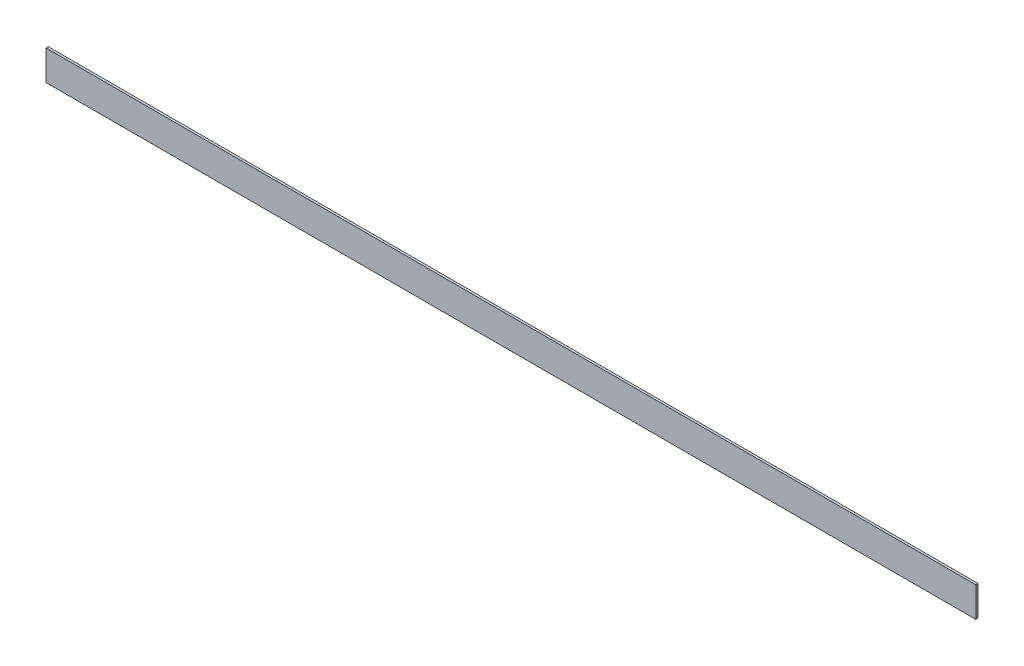
ISO-10303-21;
HEADER;
FILE_DESCRIPTION(('STEP AP214'),'2;1');
FILE_NAME('part.step','',(''),(''),'','','');
FILE_SCHEMA(('AUTOMOTIVE_DESIGN { 1 0 10303 214 1 1 1 1 }'));
ENDSEC;
DATA;
#1=APPLICATION_CONTEXT('core data for automotive mechanical design processes');
#2=APPLICATION_PROTOCOL_DEFINITION('international standard','automotive_design',2000,#1);
#3=PRODUCT_CONTEXT('',#1,'mechanical');
#4=PRODUCT('Part','Part','',(#3));
#5=PRODUCT_RELATED_PRODUCT_CATEGORY('part','',(#4));
#6=PRODUCT_DEFINITION_FORMATION('','',#4);
#7=PRODUCT_DEFINITION_CONTEXT('part definition',#1,'design');
#8=PRODUCT_DEFINITION('design','',#6,#7);
#9=PRODUCT_DEFINITION_SHAPE('','',#8);
#10=(LENGTH_UNIT() NAMED_UNIT(*) SI_UNIT(.MILLI.,.METRE.));
#11=(NAMED_UNIT(*) PLANE_ANGLE_UNIT() SI_UNIT($,.RADIAN.));
#12=(NAMED_UNIT(*) SI_UNIT($,.STERADIAN.) SOLID_ANGLE_UNIT());
#13=UNCERTAINTY_MEASURE_WITH_UNIT(LENGTH_MEASURE(1.E-05),#10,'distance_accuracy_value','');
#14=(GEOMETRIC_REPRESENTATION_CONTEXT(3) GLOBAL_UNCERTAINTY_ASSIGNED_CONTEXT((#13)) GLOBAL_UNIT_ASSIGNED_CONTEXT((#10,
#11,#12)) REPRESENTATION_CONTEXT('',''));
#15=CARTESIAN_POINT('',(0.,0.,0.));
#16=DIRECTION('',(0.,0.,1.));
#17=DIRECTION('',(1.,0.,0.));
#18=AXIS2_PLACEMENT_3D('',#15,#16,#17);
#19=CARTESIAN_POINT('',(40.,1132.,-21.5));
#20=DIRECTION('',(-1.,0.,0.));
#21=DIRECTION('',(0.,0.,1.));
#22=AXIS2_PLACEMENT_3D('',#19,#20,#21);
#23=PLANE('',#22);
#24=DIRECTION('',(0.,-1.,0.));
#25=VECTOR('',#24,1.);
#26=CARTESIAN_POINT('',(40.,1132.,-20.));
#27=LINE('',#26,#25);
#28=CARTESIAN_POINT('',(40.,1152.,-20.));
#29=VERTEX_POINT('',#28);
#30=CARTESIAN_POINT('',(40.,1132.,-20.));
#31=VERTEX_POINT('',#30);
#32=EDGE_CURVE('E103',#29,#31,#27,.T.);
#33=ORIENTED_EDGE('',*,*,#32,.F.);
#34=DIRECTION('',(0.,0.,1.));
#35=VECTOR('',#34,1.);
#36=CARTESIAN_POINT('',(40.,1152.,-21.5));
#37=LINE('',#36,#35);
#38=CARTESIAN_POINT('',(40.,1152.,-21.5));
#39=VERTEX_POINT('',#38);
#40=EDGE_CURVE('E11',#39,#29,#37,.T.);
#41=ORIENTED_EDGE('',*,*,#40,.F.);
#42=DIRECTION('',(0.,-1.,0.));
#43=VECTOR('',#42,1.);
#44=CARTESIAN_POINT('',(40.,1132.,-21.5));
#45=LINE('',#44,#43);
#46=CARTESIAN_POINT('',(40.,1132.,-21.5));
#47=VERTEX_POINT('',#46);
#48=EDGE_CURVE('E97',#39,#47,#45,.T.);
#49=ORIENTED_EDGE('',*,*,#48,.T.);
#50=DIRECTION('',(0.,0.,1.));
#51=VECTOR('',#50,1.);
#52=CARTESIAN_POINT('',(40.,1132.,-21.5));
#53=LINE('',#52,#51);
#54=EDGE_CURVE('E42',#47,#31,#53,.T.);
#55=ORIENTED_EDGE('',*,*,#54,.T.);
#56=EDGE_LOOP('',(#33,#41,#49,#55));
#57=FACE_BOUND('',#56,.T.);
#58=ADVANCED_FACE('F39',(#57),#23,.T.);
#59=CARTESIAN_POINT('',(40.,1152.,-21.5));
#60=DIRECTION('',(0.,1.,0.));
#61=DIRECTION('',(0.,0.,1.));
#62=AXIS2_PLACEMENT_3D('',#59,#60,#61);
#63=PLANE('',#62);
#64=DIRECTION('',(-1.,0.,0.));
#65=VECTOR('',#64,1.);
#66=CARTESIAN_POINT('',(40.,1152.,-20.));
#67=LINE('',#66,#65);
#68=CARTESIAN_POINT('',(660.,1152.,-20.));
#69=VERTEX_POINT('',#68);
#70=EDGE_CURVE('E99',#69,#29,#67,.T.);
#71=ORIENTED_EDGE('',*,*,#70,.F.);
#72=DIRECTION('',(0.,0.,1.));
#73=VECTOR('',#72,1.);
#74=CARTESIAN_POINT('',(660.,1152.,-21.5));
#75=LINE('',#74,#73);
#76=CARTESIAN_POINT('',(660.,1152.,-21.5));
#77=VERTEX_POINT('',#76);
#78=EDGE_CURVE('E48',#77,#69,#75,.T.);
#79=ORIENTED_EDGE('',*,*,#78,.F.);
#80=DIRECTION('',(-1.,0.,0.));
#81=VECTOR('',#80,1.);
#82=CARTESIAN_POINT('',(40.,1152.,-21.5));
#83=LINE('',#82,#81);
#84=EDGE_CURVE('E94',#77,#39,#83,.T.);
#85=ORIENTED_EDGE('',*,*,#84,.T.);
#86=ORIENTED_EDGE('',*,*,#40,.T.);
#87=EDGE_LOOP('',(#71,#79,#85,#86));
#88=FACE_BOUND('',#87,.T.);
#89=ADVANCED_FACE('F113',(#88),#63,.T.);
#90=CARTESIAN_POINT('',(660.,1132.,-21.5));
#91=DIRECTION('',(1.,0.,0.));
#92=DIRECTION('',(0.,0.,-1.));
#93=AXIS2_PLACEMENT_3D('',#90,#91,#92);
#94=PLANE('',#93);
#95=DIRECTION('',(0.,1.,0.));
#96=VECTOR('',#95,1.);
#97=CARTESIAN_POINT('',(660.,1132.,-20.));
#98=LINE('',#97,#96);
#99=CARTESIAN_POINT('',(660.,1132.,-20.));
#100=VERTEX_POINT('',#99);
#101=EDGE_CURVE('E89',#100,#69,#98,.T.);
#102=ORIENTED_EDGE('',*,*,#101,.F.);
#103=DIRECTION('',(0.,0.,1.));
#104=VECTOR('',#103,1.);
#105=CARTESIAN_POINT('',(660.,1132.,-21.5));
#106=LINE('',#105,#104);
#107=CARTESIAN_POINT('',(660.,1132.,-21.5));
#108=VERTEX_POINT('',#107);
#109=EDGE_CURVE('E84',#108,#100,#106,.T.);
#110=ORIENTED_EDGE('',*,*,#109,.F.);
#111=DIRECTION('',(0.,1.,0.));
#112=VECTOR('',#111,1.);
#113=CARTESIAN_POINT('',(660.,1132.,-21.5));
#114=LINE('',#113,#112);
#115=EDGE_CURVE('E87',#108,#77,#114,.T.);
#116=ORIENTED_EDGE('',*,*,#115,.T.);
#117=ORIENTED_EDGE('',*,*,#78,.T.);
#118=EDGE_LOOP('',(#102,#110,#116,#117));
#119=FACE_BOUND('',#118,.T.);
#120=ADVANCED_FACE('F86',(#119),#94,.T.);
#121=CARTESIAN_POINT('',(40.,1132.,-21.5));
#122=DIRECTION('',(0.,-1.,0.));
#123=DIRECTION('',(0.,0.,-1.));
#124=AXIS2_PLACEMENT_3D('',#121,#122,#123);
#125=PLANE('',#124);
#126=DIRECTION('',(1.,0.,0.));
#127=VECTOR('',#126,1.);
#128=CARTESIAN_POINT('',(40.,1132.,-20.));
#129=LINE('',#128,#127);
#130=EDGE_CURVE('E106',#31,#100,#129,.T.);
#131=ORIENTED_EDGE('',*,*,#130,.F.);
#132=ORIENTED_EDGE('',*,*,#54,.F.);
#133=DIRECTION('',(1.,0.,0.));
#134=VECTOR('',#133,1.);
#135=CARTESIAN_POINT('',(40.,1132.,-21.5));
#136=LINE('',#135,#134);
#137=EDGE_CURVE('E93',#47,#108,#136,.T.);
#138=ORIENTED_EDGE('',*,*,#137,.T.);
#139=ORIENTED_EDGE('',*,*,#109,.T.);
#140=EDGE_LOOP('',(#131,#132,#138,#139));
#141=FACE_BOUND('',#140,.T.);
#142=ADVANCED_FACE('F96',(#141),#125,.T.);
#143=CARTESIAN_POINT('',(0.,0.,-21.5));
#144=DIRECTION('',(0.,0.,-1.));
#145=DIRECTION('',(-1.,0.,0.));
#146=AXIS2_PLACEMENT_3D('',#143,#144,#145);
#147=PLANE('',#146);
#148=ORIENTED_EDGE('',*,*,#48,.F.);
#149=ORIENTED_EDGE('',*,*,#84,.F.);
#150=ORIENTED_EDGE('',*,*,#115,.F.);
#151=ORIENTED_EDGE('',*,*,#137,.F.);
#152=EDGE_LOOP('',(#148,#149,#150,#151));
#153=FACE_BOUND('',#152,.T.);
#154=ADVANCED_FACE('F92',(#153),#147,.T.);
#155=CARTESIAN_POINT('',(0.,0.,-20.));
#156=DIRECTION('',(0.,0.,-1.));
#157=DIRECTION('',(-1.,0.,0.));
#158=AXIS2_PLACEMENT_3D('',#155,#156,#157);
#159=PLANE('',#158);
#160=ORIENTED_EDGE('',*,*,#32,.T.);
#161=ORIENTED_EDGE('',*,*,#130,.T.);
#162=ORIENTED_EDGE('',*,*,#101,.T.);
#163=ORIENTED_EDGE('',*,*,#70,.T.);
#164=EDGE_LOOP('',(#160,#161,#162,#163));
#165=FACE_BOUND('',#164,.T.);
#166=ADVANCED_FACE('F112',(#165),#159,.F.);
#167=CLOSED_SHELL('',(#58,#89,#120,#142,#154,#166));
#168=MANIFOLD_SOLID_BREP('B2',#167);
#169=ADVANCED_BREP_SHAPE_REPRESENTATION('',(#18,#168),#14);
#170=SHAPE_DEFINITION_REPRESENTATION(#9,#169);
ENDSEC;
END-ISO-10303-21;
